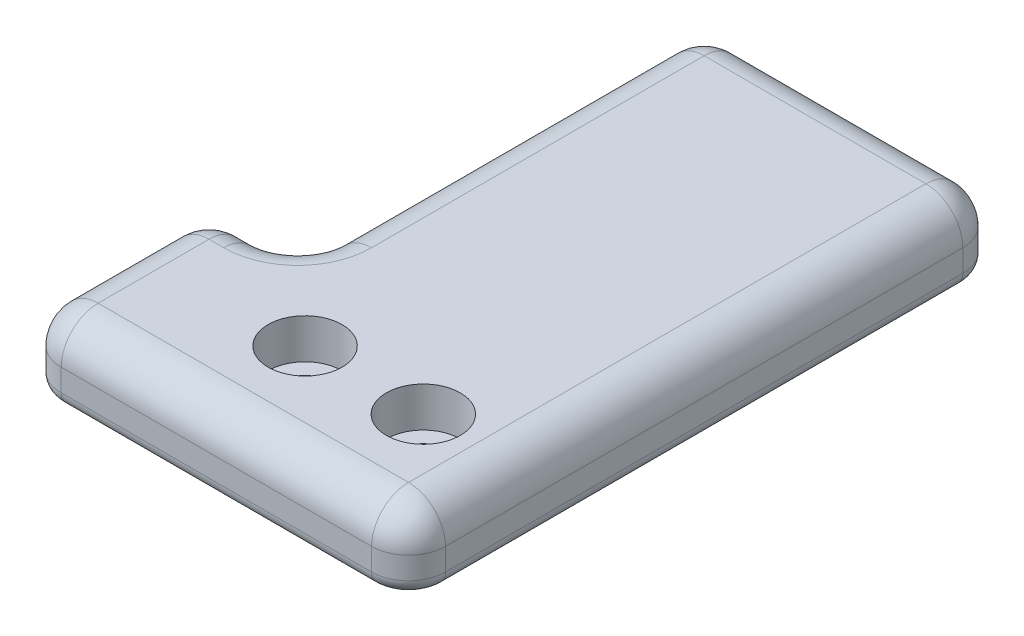
ISO-10303-21;
HEADER;
FILE_DESCRIPTION(('STEP AP214'),'2;1');
FILE_NAME('part.step','',(''),(''),'','','');
FILE_SCHEMA(('AUTOMOTIVE_DESIGN { 1 0 10303 214 1 1 1 1 }'));
ENDSEC;
DATA;
#1=APPLICATION_CONTEXT('core data for automotive mechanical design processes');
#2=APPLICATION_PROTOCOL_DEFINITION('international standard','automotive_design',2000,#1);
#3=PRODUCT_CONTEXT('',#1,'mechanical');
#4=PRODUCT('Part','Part','',(#3));
#5=PRODUCT_RELATED_PRODUCT_CATEGORY('part','',(#4));
#6=PRODUCT_DEFINITION_FORMATION('','',#4);
#7=PRODUCT_DEFINITION_CONTEXT('part definition',#1,'design');
#8=PRODUCT_DEFINITION('design','',#6,#7);
#9=PRODUCT_DEFINITION_SHAPE('','',#8);
#10=(LENGTH_UNIT() NAMED_UNIT(*) SI_UNIT(.MILLI.,.METRE.));
#11=(NAMED_UNIT(*) PLANE_ANGLE_UNIT() SI_UNIT($,.RADIAN.));
#12=(NAMED_UNIT(*) SI_UNIT($,.STERADIAN.) SOLID_ANGLE_UNIT());
#13=UNCERTAINTY_MEASURE_WITH_UNIT(LENGTH_MEASURE(1.E-05),#10,'distance_accuracy_value','');
#14=(GEOMETRIC_REPRESENTATION_CONTEXT(3) GLOBAL_UNCERTAINTY_ASSIGNED_CONTEXT((#13)) GLOBAL_UNIT_ASSIGNED_CONTEXT((#10,
#11,#12)) REPRESENTATION_CONTEXT('',''));
#15=CARTESIAN_POINT('',(0.,0.,0.));
#16=DIRECTION('',(0.,0.,1.));
#17=DIRECTION('',(1.,0.,0.));
#18=AXIS2_PLACEMENT_3D('',#15,#16,#17);
#19=CARTESIAN_POINT('',(15.7975674601214,10.,0.));
#20=DIRECTION('',(-1.,0.,0.));
#21=DIRECTION('',(0.,0.,-1.));
#22=AXIS2_PLACEMENT_3D('',#19,#20,#21);
#23=PLANE('',#22);
#24=DIRECTION('',(0.,-1.,0.));
#25=VECTOR('',#24,1.);
#26=CARTESIAN_POINT('',(15.7975674601214,10.,67.0000000000004));
#27=LINE('',#26,#25);
#28=CARTESIAN_POINT('',(15.7975674601214,5.,67.0000000000004));
#29=VERTEX_POINT('',#28);
#30=CARTESIAN_POINT('',(15.7975674601214,2.,67.0000000000004));
#31=VERTEX_POINT('',#30);
#32=EDGE_CURVE('E357',#29,#31,#27,.T.);
#33=ORIENTED_EDGE('',*,*,#32,.F.);
#34=DIRECTION('',(0.,0.,1.));
#35=VECTOR('',#34,1.);
#36=CARTESIAN_POINT('',(15.7975674601214,5.,0.));
#37=LINE('',#36,#35);
#38=CARTESIAN_POINT('',(15.7975674601214,5.,52.0000000000003));
#39=VERTEX_POINT('',#38);
#40=EDGE_CURVE('E356',#39,#29,#37,.T.);
#41=ORIENTED_EDGE('',*,*,#40,.F.);
#42=DIRECTION('',(0.,-1.,0.));
#43=VECTOR('',#42,1.);
#44=CARTESIAN_POINT('',(15.7975674601214,10.,52.0000000000003));
#45=LINE('',#44,#43);
#46=CARTESIAN_POINT('',(15.7975674601214,2.,52.0000000000003));
#47=VERTEX_POINT('',#46);
#48=EDGE_CURVE('E217',#47,#39,#45,.F.);
#49=ORIENTED_EDGE('',*,*,#48,.F.);
#50=DIRECTION('',(0.,0.,1.));
#51=VECTOR('',#50,1.);
#52=CARTESIAN_POINT('',(15.7975674601214,2.,52.0000000000003));
#53=LINE('',#52,#51);
#54=EDGE_CURVE('E301',#31,#47,#53,.F.);
#55=ORIENTED_EDGE('',*,*,#54,.F.);
#56=EDGE_LOOP('',(#33,#41,#49,#55));
#57=FACE_BOUND('',#56,.T.);
#58=ADVANCED_FACE('F39',(#57),#23,.T.);
#59=CARTESIAN_POINT('',(3.26128013483643E-13,10.,47.0000000000005));
#60=DIRECTION('',(0.,0.,-1.));
#61=DIRECTION('',(1.,0.,0.));
#62=AXIS2_PLACEMENT_3D('',#59,#60,#61);
#63=PLANE('',#62);
#64=DIRECTION('',(0.,-1.,0.));
#65=VECTOR('',#64,1.);
#66=CARTESIAN_POINT('',(20.7975674601214,10.,47.0000000000003));
#67=LINE('',#66,#65);
#68=CARTESIAN_POINT('',(20.7975674601214,5.,47.0000000000003));
#69=VERTEX_POINT('',#68);
#70=CARTESIAN_POINT('',(20.7975674601214,2.,47.0000000000003));
#71=VERTEX_POINT('',#70);
#72=EDGE_CURVE('E349',#69,#71,#67,.T.);
#73=ORIENTED_EDGE('',*,*,#72,.F.);
#74=DIRECTION('',(-1.,0.,0.));
#75=VECTOR('',#74,1.);
#76=CARTESIAN_POINT('',(3.26128013483643E-13,5.,47.0000000000005));
#77=LINE('',#76,#75);
#78=CARTESIAN_POINT('',(22.7975674601214,5.,47.0000000000003));
#79=VERTEX_POINT('',#78);
#80=EDGE_CURVE('E405',#79,#69,#77,.T.);
#81=ORIENTED_EDGE('',*,*,#80,.F.);
#82=DIRECTION('',(0.,-1.,0.));
#83=VECTOR('',#82,1.);
#84=CARTESIAN_POINT('',(22.7975674601214,10.,47.0000000000003));
#85=LINE('',#84,#83);
#86=CARTESIAN_POINT('',(22.7975674601214,2.,47.0000000000003));
#87=VERTEX_POINT('',#86);
#88=EDGE_CURVE('E209',#87,#79,#85,.F.);
#89=ORIENTED_EDGE('',*,*,#88,.F.);
#90=DIRECTION('',(-1.,0.,0.));
#91=VECTOR('',#90,1.);
#92=CARTESIAN_POINT('',(22.7975674601214,2.,47.0000000000003));
#93=LINE('',#92,#91);
#94=EDGE_CURVE('E307',#71,#87,#93,.F.);
#95=ORIENTED_EDGE('',*,*,#94,.F.);
#96=EDGE_LOOP('',(#73,#81,#89,#95));
#97=FACE_BOUND('',#96,.T.);
#98=ADVANCED_FACE('F496',(#97),#63,.T.);
#99=CARTESIAN_POINT('',(27.7975674601214,10.,0.));
#100=DIRECTION('',(-1.,0.,0.));
#101=DIRECTION('',(0.,0.,-1.));
#102=AXIS2_PLACEMENT_3D('',#99,#100,#101);
#103=PLANE('',#102);
#104=DIRECTION('',(0.,-1.,0.));
#105=VECTOR('',#104,1.);
#106=CARTESIAN_POINT('',(27.7975674601214,0.,42.0000000000003));
#107=LINE('',#106,#105);
#108=CARTESIAN_POINT('',(27.7975674601214,5.,42.0000000000003));
#109=VERTEX_POINT('',#108);
#110=CARTESIAN_POINT('',(27.7975674601214,2.,42.0000000000003));
#111=VERTEX_POINT('',#110);
#112=EDGE_CURVE('E218',#109,#111,#107,.T.);
#113=ORIENTED_EDGE('',*,*,#112,.F.);
#114=DIRECTION('',(0.,0.,1.));
#115=VECTOR('',#114,1.);
#116=CARTESIAN_POINT('',(27.7975674601214,5.,0.));
#117=LINE('',#116,#115);
#118=CARTESIAN_POINT('',(27.7975674601214,5.,-2.99999999999973));
#119=VERTEX_POINT('',#118);
#120=EDGE_CURVE('E192',#119,#109,#117,.T.);
#121=ORIENTED_EDGE('',*,*,#120,.F.);
#122=DIRECTION('',(0.,-1.,0.));
#123=VECTOR('',#122,1.);
#124=CARTESIAN_POINT('',(27.7975674601214,10.,-2.99999999999973));
#125=LINE('',#124,#123);
#126=CARTESIAN_POINT('',(27.7975674601214,2.,-2.99999999999973));
#127=VERTEX_POINT('',#126);
#128=EDGE_CURVE('E212',#127,#119,#125,.F.);
#129=ORIENTED_EDGE('',*,*,#128,.F.);
#130=DIRECTION('',(0.,0.,1.));
#131=VECTOR('',#130,1.);
#132=CARTESIAN_POINT('',(27.7975674601214,2.,-2.99999999999973));
#133=LINE('',#132,#131);
#134=EDGE_CURVE('E313',#111,#127,#133,.F.);
#135=ORIENTED_EDGE('',*,*,#134,.F.);
#136=EDGE_LOOP('',(#113,#121,#129,#135));
#137=FACE_BOUND('',#136,.T.);
#138=ADVANCED_FACE('F220',(#137),#103,.T.);
#139=CARTESIAN_POINT('',(0.,10.,-7.99999999999973));
#140=DIRECTION('',(0.,0.,1.));
#141=DIRECTION('',(-1.,0.,0.));
#142=AXIS2_PLACEMENT_3D('',#139,#140,#141);
#143=PLANE('',#142);
#144=DIRECTION('',(0.,-1.,0.));
#145=VECTOR('',#144,1.);
#146=CARTESIAN_POINT('',(32.7975674601214,0.,-7.99999999999973));
#147=LINE('',#146,#145);
#148=CARTESIAN_POINT('',(32.7975674601214,5.,-7.99999999999973));
#149=VERTEX_POINT('',#148);
#150=CARTESIAN_POINT('',(32.7975674601214,2.,-7.99999999999973));
#151=VERTEX_POINT('',#150);
#152=EDGE_CURVE('E428',#149,#151,#147,.T.);
#153=ORIENTED_EDGE('',*,*,#152,.F.);
#154=DIRECTION('',(1.,0.,0.));
#155=VECTOR('',#154,1.);
#156=CARTESIAN_POINT('',(32.7975674601214,5.,-7.99999999999973));
#157=LINE('',#156,#155);
#158=CARTESIAN_POINT('',(62.7975674601214,5.,-7.99999999999973));
#159=VERTEX_POINT('',#158);
#160=EDGE_CURVE('E223',#159,#149,#157,.F.);
#161=ORIENTED_EDGE('',*,*,#160,.F.);
#162=DIRECTION('',(0.,-1.,0.));
#163=VECTOR('',#162,1.);
#164=CARTESIAN_POINT('',(62.7975674601214,10.,-7.99999999999973));
#165=LINE('',#164,#163);
#166=CARTESIAN_POINT('',(62.7975674601214,2.,-7.99999999999973));
#167=VERTEX_POINT('',#166);
#168=EDGE_CURVE('E253',#167,#159,#165,.F.);
#169=ORIENTED_EDGE('',*,*,#168,.F.);
#170=DIRECTION('',(1.,0.,0.));
#171=VECTOR('',#170,1.);
#172=CARTESIAN_POINT('',(0.,2.,-7.99999999999973));
#173=LINE('',#172,#171);
#174=EDGE_CURVE('E11',#151,#167,#173,.T.);
#175=ORIENTED_EDGE('',*,*,#174,.F.);
#176=EDGE_LOOP('',(#153,#161,#169,#175));
#177=FACE_BOUND('',#176,.T.);
#178=ADVANCED_FACE('F431',(#177),#143,.F.);
#179=CARTESIAN_POINT('',(67.7975674601214,10.,0.));
#180=DIRECTION('',(-1.,0.,0.));
#181=DIRECTION('',(0.,0.,-1.));
#182=AXIS2_PLACEMENT_3D('',#179,#180,#181);
#183=PLANE('',#182);
#184=DIRECTION('',(0.,-1.,0.));
#185=VECTOR('',#184,1.);
#186=CARTESIAN_POINT('',(67.7975674601214,10.,-2.99999999999973));
#187=LINE('',#186,#185);
#188=CARTESIAN_POINT('',(67.7975674601214,5.,-2.99999999999973));
#189=VERTEX_POINT('',#188);
#190=CARTESIAN_POINT('',(67.7975674601214,2.,-2.99999999999973));
#191=VERTEX_POINT('',#190);
#192=EDGE_CURVE('E368',#189,#191,#187,.T.);
#193=ORIENTED_EDGE('',*,*,#192,.F.);
#194=DIRECTION('',(0.,0.,1.));
#195=VECTOR('',#194,1.);
#196=CARTESIAN_POINT('',(67.7975674601214,5.,-2.99999999999973));
#197=LINE('',#196,#195);
#198=CARTESIAN_POINT('',(67.7975674601214,5.,67.0000000000003));
#199=VERTEX_POINT('',#198);
#200=EDGE_CURVE('E414',#199,#189,#197,.F.);
#201=ORIENTED_EDGE('',*,*,#200,.F.);
#202=DIRECTION('',(0.,-1.,0.));
#203=VECTOR('',#202,1.);
#204=CARTESIAN_POINT('',(67.7975674601214,10.,67.0000000000003));
#205=LINE('',#204,#203);
#206=CARTESIAN_POINT('',(67.7975674601214,2.,67.0000000000003));
#207=VERTEX_POINT('',#206);
#208=EDGE_CURVE('E371',#207,#199,#205,.F.);
#209=ORIENTED_EDGE('',*,*,#208,.F.);
#210=DIRECTION('',(0.,0.,1.));
#211=VECTOR('',#210,1.);
#212=CARTESIAN_POINT('',(67.7975674601214,2.,0.));
#213=LINE('',#212,#211);
#214=EDGE_CURVE('E289',#191,#207,#213,.T.);
#215=ORIENTED_EDGE('',*,*,#214,.F.);
#216=EDGE_LOOP('',(#193,#201,#209,#215));
#217=FACE_BOUND('',#216,.T.);
#218=ADVANCED_FACE('F446',(#217),#183,.F.);
#219=CARTESIAN_POINT('',(1.15292391018767E-13,10.,72.0000000000004));
#220=DIRECTION('',(0.,0.,1.));
#221=DIRECTION('',(-1.,0.,0.));
#222=AXIS2_PLACEMENT_3D('',#219,#220,#221);
#223=PLANE('',#222);
#224=DIRECTION('',(0.,-1.,0.));
#225=VECTOR('',#224,1.);
#226=CARTESIAN_POINT('',(62.7975674601214,0.,72.0000000000003));
#227=LINE('',#226,#225);
#228=CARTESIAN_POINT('',(62.7975674601214,5.,72.0000000000003));
#229=VERTEX_POINT('',#228);
#230=CARTESIAN_POINT('',(62.7975674601214,2.,72.0000000000003));
#231=VERTEX_POINT('',#230);
#232=EDGE_CURVE('E359',#229,#231,#227,.T.);
#233=ORIENTED_EDGE('',*,*,#232,.F.);
#234=DIRECTION('',(1.,0.,0.));
#235=VECTOR('',#234,1.);
#236=CARTESIAN_POINT('',(1.15292391018767E-13,5.,72.0000000000004));
#237=LINE('',#236,#235);
#238=CARTESIAN_POINT('',(20.7975674601214,5.,72.0000000000004));
#239=VERTEX_POINT('',#238);
#240=EDGE_CURVE('E411',#239,#229,#237,.T.);
#241=ORIENTED_EDGE('',*,*,#240,.F.);
#242=DIRECTION('',(0.,-1.,0.));
#243=VECTOR('',#242,1.);
#244=CARTESIAN_POINT('',(20.7975674601214,10.,72.0000000000004));
#245=LINE('',#244,#243);
#246=CARTESIAN_POINT('',(20.7975674601214,2.,72.0000000000004));
#247=VERTEX_POINT('',#246);
#248=EDGE_CURVE('E365',#247,#239,#245,.F.);
#249=ORIENTED_EDGE('',*,*,#248,.F.);
#250=DIRECTION('',(1.,0.,0.));
#251=VECTOR('',#250,1.);
#252=CARTESIAN_POINT('',(20.7975674601214,2.,72.0000000000004));
#253=LINE('',#252,#251);
#254=EDGE_CURVE('E295',#231,#247,#253,.F.);
#255=ORIENTED_EDGE('',*,*,#254,.F.);
#256=EDGE_LOOP('',(#233,#241,#249,#255));
#257=FACE_BOUND('',#256,.T.);
#258=ADVANCED_FACE('F686',(#257),#223,.T.);
#259=CARTESIAN_POINT('',(0.,10.,0.));
#260=DIRECTION('',(0.,1.,0.));
#261=DIRECTION('',(0.,0.,-1.));
#262=AXIS2_PLACEMENT_3D('',#259,#260,#261);
#263=PLANE('',#262);
#264=CARTESIAN_POINT('',(55.7975674601214,10.,58.0000000000002));
#265=DIRECTION('',(0.,-1.,0.));
#266=DIRECTION('',(0.,0.,-1.));
#267=AXIS2_PLACEMENT_3D('',#264,#265,#266);
#268=CIRCLE('',#267,5.);
#269=CARTESIAN_POINT('',(55.7975674601214,10.,53.0000000000002));
#270=VERTEX_POINT('',#269);
#271=EDGE_CURVE('E478',#270,#270,#268,.T.);
#272=ORIENTED_EDGE('',*,*,#271,.T.);
#273=EDGE_LOOP('',(#272));
#274=FACE_BOUND('',#273,.T.);
#275=CARTESIAN_POINT('',(39.7975674601214,10.,58.0000000000003));
#276=DIRECTION('',(0.,-1.,0.));
#277=DIRECTION('',(0.,0.,-1.));
#278=AXIS2_PLACEMENT_3D('',#275,#276,#277);
#279=CIRCLE('',#278,5.);
#280=CARTESIAN_POINT('',(39.7975674601214,10.,53.0000000000003));
#281=VERTEX_POINT('',#280);
#282=EDGE_CURVE('E466',#281,#281,#279,.T.);
#283=ORIENTED_EDGE('',*,*,#282,.T.);
#284=EDGE_LOOP('',(#283));
#285=FACE_BOUND('',#284,.T.);
#286=DIRECTION('',(1.,0.,0.));
#287=VECTOR('',#286,1.);
#288=CARTESIAN_POINT('',(1.07285974975797E-13,10.,67.0000000000004));
#289=LINE('',#288,#287);
#290=CARTESIAN_POINT('',(62.7975674601214,10.,67.0000000000003));
#291=VERTEX_POINT('',#290);
#292=CARTESIAN_POINT('',(20.7975674601214,10.,67.0000000000004));
#293=VERTEX_POINT('',#292);
#294=EDGE_CURVE('E390',#291,#293,#289,.F.);
#295=ORIENTED_EDGE('',*,*,#294,.F.);
#296=DIRECTION('',(0.,0.,1.));
#297=VECTOR('',#296,1.);
#298=CARTESIAN_POINT('',(62.7975674601214,10.,67.0000000000003));
#299=LINE('',#298,#297);
#300=CARTESIAN_POINT('',(62.7975674601214,10.,-2.99999999999973));
#301=VERTEX_POINT('',#300);
#302=EDGE_CURVE('E387',#301,#291,#299,.T.);
#303=ORIENTED_EDGE('',*,*,#302,.F.);
#304=DIRECTION('',(1.,0.,0.));
#305=VECTOR('',#304,1.);
#306=CARTESIAN_POINT('',(62.7975674601214,10.,-2.99999999999973));
#307=LINE('',#306,#305);
#308=CARTESIAN_POINT('',(32.7975674601214,10.,-2.99999999999973));
#309=VERTEX_POINT('',#308);
#310=EDGE_CURVE('E384',#309,#301,#307,.T.);
#311=ORIENTED_EDGE('',*,*,#310,.F.);
#312=DIRECTION('',(0.,0.,1.));
#313=VECTOR('',#312,1.);
#314=CARTESIAN_POINT('',(32.7975674601214,10.,0.));
#315=LINE('',#314,#313);
#316=CARTESIAN_POINT('',(32.7975674601214,10.,42.0000000000003));
#317=VERTEX_POINT('',#316);
#318=EDGE_CURVE('E195',#317,#309,#315,.F.);
#319=ORIENTED_EDGE('',*,*,#318,.F.);
#320=CARTESIAN_POINT('',(22.7975674601214,10.,42.0000000000003));
#321=DIRECTION('',(0.,-1.,0.));
#322=DIRECTION('',(0.,0.,-1.));
#323=AXIS2_PLACEMENT_3D('',#320,#321,#322);
#324=CIRCLE('',#323,10.);
#325=CARTESIAN_POINT('',(22.7975674601215,10.,52.0000000000003));
#326=VERTEX_POINT('',#325);
#327=EDGE_CURVE('E393',#326,#317,#324,.F.);
#328=ORIENTED_EDGE('',*,*,#327,.F.);
#329=DIRECTION('',(-1.,0.,0.));
#330=VECTOR('',#329,1.);
#331=CARTESIAN_POINT('',(3.60822483003179E-13,10.,52.0000000000005));
#332=LINE('',#331,#330);
#333=CARTESIAN_POINT('',(20.7975674601214,10.,52.0000000000003));
#334=VERTEX_POINT('',#333);
#335=EDGE_CURVE('E396',#334,#326,#332,.F.);
#336=ORIENTED_EDGE('',*,*,#335,.F.);
#337=DIRECTION('',(0.,0.,1.));
#338=VECTOR('',#337,1.);
#339=CARTESIAN_POINT('',(20.7975674601214,10.,0.));
#340=LINE('',#339,#338);
#341=EDGE_CURVE('E399',#293,#334,#340,.F.);
#342=ORIENTED_EDGE('',*,*,#341,.F.);
#343=EDGE_LOOP('',(#295,#303,#311,#319,#328,#336,#342));
#344=FACE_BOUND('',#343,.T.);
#345=ADVANCED_FACE('F437',(#274,#285,#344),#263,.T.);
#346=CARTESIAN_POINT('',(0.,0.,0.));
#347=DIRECTION('',(0.,1.,0.));
#348=DIRECTION('',(0.,0.,-1.));
#349=AXIS2_PLACEMENT_3D('',#346,#347,#348);
#350=PLANE('',#349);
#351=CARTESIAN_POINT('',(55.7975674601214,0.,58.0000000000002));
#352=DIRECTION('',(0.,-1.,0.));
#353=DIRECTION('',(0.,0.,-1.));
#354=AXIS2_PLACEMENT_3D('',#351,#352,#353);
#355=CIRCLE('',#354,2.75);
#356=CARTESIAN_POINT('',(55.7975674601214,0.,55.2500000000002));
#357=VERTEX_POINT('',#356);
#358=EDGE_CURVE('E469',#357,#357,#355,.T.);
#359=ORIENTED_EDGE('',*,*,#358,.F.);
#360=EDGE_LOOP('',(#359));
#361=FACE_BOUND('',#360,.T.);
#362=CARTESIAN_POINT('',(39.7975674601214,0.,58.0000000000003));
#363=DIRECTION('',(0.,-1.,0.));
#364=DIRECTION('',(0.,0.,-1.));
#365=AXIS2_PLACEMENT_3D('',#362,#363,#364);
#366=CIRCLE('',#365,2.75);
#367=CARTESIAN_POINT('',(39.7975674601214,0.,55.2500000000003));
#368=VERTEX_POINT('',#367);
#369=EDGE_CURVE('E319',#368,#368,#366,.T.);
#370=ORIENTED_EDGE('',*,*,#369,.F.);
#371=EDGE_LOOP('',(#370));
#372=FACE_BOUND('',#371,.T.);
#373=DIRECTION('',(0.,0.,1.));
#374=VECTOR('',#373,1.);
#375=CARTESIAN_POINT('',(65.7975674601214,0.,0.));
#376=LINE('',#375,#374);
#377=CARTESIAN_POINT('',(65.7975674601214,0.,67.0000000000003));
#378=VERTEX_POINT('',#377);
#379=CARTESIAN_POINT('',(65.7975674601214,0.,-2.99999999999973));
#380=VERTEX_POINT('',#379);
#381=EDGE_CURVE('E280',#378,#380,#376,.F.);
#382=ORIENTED_EDGE('',*,*,#381,.F.);
#383=CARTESIAN_POINT('',(62.7975674601214,0.,67.0000000000003));
#384=DIRECTION('',(0.,-1.,0.));
#385=DIRECTION('',(0.,0.,-1.));
#386=AXIS2_PLACEMENT_3D('',#383,#384,#385);
#387=CIRCLE('',#386,3.);
#388=CARTESIAN_POINT('',(62.7975674601214,0.,70.0000000000003));
#389=VERTEX_POINT('',#388);
#390=EDGE_CURVE('E277',#389,#378,#387,.F.);
#391=ORIENTED_EDGE('',*,*,#390,.F.);
#392=DIRECTION('',(1.,0.,0.));
#393=VECTOR('',#392,1.);
#394=CARTESIAN_POINT('',(62.7975674601214,0.,70.0000000000003));
#395=LINE('',#394,#393);
#396=CARTESIAN_POINT('',(20.7975674601214,0.,70.0000000000004));
#397=VERTEX_POINT('',#396);
#398=EDGE_CURVE('E274',#397,#389,#395,.T.);
#399=ORIENTED_EDGE('',*,*,#398,.F.);
#400=CARTESIAN_POINT('',(20.7975674601214,0.,67.0000000000004));
#401=DIRECTION('',(0.,-1.,0.));
#402=DIRECTION('',(0.,0.,-1.));
#403=AXIS2_PLACEMENT_3D('',#400,#401,#402);
#404=CIRCLE('',#403,3.);
#405=CARTESIAN_POINT('',(17.7975674601214,0.,67.0000000000004));
#406=VERTEX_POINT('',#405);
#407=EDGE_CURVE('E271',#406,#397,#404,.F.);
#408=ORIENTED_EDGE('',*,*,#407,.F.);
#409=DIRECTION('',(0.,0.,1.));
#410=VECTOR('',#409,1.);
#411=CARTESIAN_POINT('',(17.7975674601214,0.,67.0000000000004));
#412=LINE('',#411,#410);
#413=CARTESIAN_POINT('',(17.7975674601214,0.,52.0000000000003));
#414=VERTEX_POINT('',#413);
#415=EDGE_CURVE('E268',#414,#406,#412,.T.);
#416=ORIENTED_EDGE('',*,*,#415,.F.);
#417=CARTESIAN_POINT('',(20.7975674601214,0.,52.0000000000003));
#418=DIRECTION('',(0.,-1.,0.));
#419=DIRECTION('',(0.,0.,-1.));
#420=AXIS2_PLACEMENT_3D('',#417,#418,#419);
#421=CIRCLE('',#420,3.);
#422=CARTESIAN_POINT('',(20.7975674601214,0.,49.0000000000003));
#423=VERTEX_POINT('',#422);
#424=EDGE_CURVE('E265',#423,#414,#421,.F.);
#425=ORIENTED_EDGE('',*,*,#424,.F.);
#426=DIRECTION('',(-1.,0.,0.));
#427=VECTOR('',#426,1.);
#428=CARTESIAN_POINT('',(20.7975674601214,0.,49.0000000000003));
#429=LINE('',#428,#427);
#430=CARTESIAN_POINT('',(22.7975674601214,0.,49.0000000000003));
#431=VERTEX_POINT('',#430);
#432=EDGE_CURVE('E262',#431,#423,#429,.T.);
#433=ORIENTED_EDGE('',*,*,#432,.F.);
#434=CARTESIAN_POINT('',(22.7975674601214,0.,42.0000000000003));
#435=DIRECTION('',(0.,-1.,0.));
#436=DIRECTION('',(0.,0.,-1.));
#437=AXIS2_PLACEMENT_3D('',#434,#435,#436);
#438=CIRCLE('',#437,7.);
#439=CARTESIAN_POINT('',(29.7975674601214,0.,42.0000000000003));
#440=VERTEX_POINT('',#439);
#441=EDGE_CURVE('E259',#440,#431,#438,.T.);
#442=ORIENTED_EDGE('',*,*,#441,.F.);
#443=DIRECTION('',(0.,0.,1.));
#444=VECTOR('',#443,1.);
#445=CARTESIAN_POINT('',(29.7975674601214,0.,42.0000000000003));
#446=LINE('',#445,#444);
#447=CARTESIAN_POINT('',(29.7975674601214,0.,-2.99999999999973));
#448=VERTEX_POINT('',#447);
#449=EDGE_CURVE('E256',#448,#440,#446,.T.);
#450=ORIENTED_EDGE('',*,*,#449,.F.);
#451=CARTESIAN_POINT('',(32.7975674601214,0.,-2.99999999999973));
#452=DIRECTION('',(0.,-1.,0.));
#453=DIRECTION('',(0.,0.,-1.));
#454=AXIS2_PLACEMENT_3D('',#451,#452,#453);
#455=CIRCLE('',#454,3.);
#456=CARTESIAN_POINT('',(32.7975674601214,0.,-5.99999999999973));
#457=VERTEX_POINT('',#456);
#458=EDGE_CURVE('E225',#457,#448,#455,.F.);
#459=ORIENTED_EDGE('',*,*,#458,.F.);
#460=DIRECTION('',(1.,0.,0.));
#461=VECTOR('',#460,1.);
#462=CARTESIAN_POINT('',(0.,0.,-5.99999999999973));
#463=LINE('',#462,#461);
#464=CARTESIAN_POINT('',(62.7975674601214,0.,-5.99999999999973));
#465=VERTEX_POINT('',#464);
#466=EDGE_CURVE('E222',#465,#457,#463,.F.);
#467=ORIENTED_EDGE('',*,*,#466,.F.);
#468=CARTESIAN_POINT('',(62.7975674601214,0.,-2.99999999999973));
#469=DIRECTION('',(0.,-1.,0.));
#470=DIRECTION('',(0.,0.,-1.));
#471=AXIS2_PLACEMENT_3D('',#468,#469,#470);
#472=CIRCLE('',#471,3.);
#473=EDGE_CURVE('E283',#380,#465,#472,.F.);
#474=ORIENTED_EDGE('',*,*,#473,.F.);
#475=EDGE_LOOP('',(#382,#391,#399,#408,#416,#425,#433,#442,#450,#459,#467,#474));
#476=FACE_BOUND('',#475,.T.);
#477=ADVANCED_FACE('F508',(#361,#372,#476),#350,.F.);
#478=CARTESIAN_POINT('',(32.7975674601214,10.,-2.99999999999973));
#479=DIRECTION('',(0.,1.,0.));
#480=DIRECTION('',(0.,0.,-1.));
#481=AXIS2_PLACEMENT_3D('',#478,#479,#480);
#482=CYLINDRICAL_SURFACE('',#481,5.);
#483=ORIENTED_EDGE('',*,*,#128,.T.);
#484=CARTESIAN_POINT('',(32.7975674601214,5.,-2.99999999999973));
#485=DIRECTION('',(0.,-1.,0.));
#486=DIRECTION('',(0.,0.,-1.));
#487=AXIS2_PLACEMENT_3D('',#484,#485,#486);
#488=CIRCLE('',#487,5.);
#489=EDGE_CURVE('E202',#149,#119,#488,.F.);
#490=ORIENTED_EDGE('',*,*,#489,.F.);
#491=ORIENTED_EDGE('',*,*,#152,.T.);
#492=CARTESIAN_POINT('',(32.7975674601214,2.,-2.99999999999973));
#493=DIRECTION('',(0.,-1.,0.));
#494=DIRECTION('',(0.,0.,-1.));
#495=AXIS2_PLACEMENT_3D('',#492,#493,#494);
#496=CIRCLE('',#495,5.);
#497=EDGE_CURVE('E48',#127,#151,#496,.T.);
#498=ORIENTED_EDGE('',*,*,#497,.F.);
#499=EDGE_LOOP('',(#483,#490,#491,#498));
#500=FACE_BOUND('',#499,.T.);
#501=ADVANCED_FACE('F213',(#500),#482,.T.);
#502=CARTESIAN_POINT('',(20.7975674601214,10.,67.0000000000004));
#503=DIRECTION('',(0.,-1.,0.));
#504=DIRECTION('',(0.,0.,1.));
#505=AXIS2_PLACEMENT_3D('',#502,#503,#504);
#506=CYLINDRICAL_SURFACE('',#505,5.);
#507=ORIENTED_EDGE('',*,*,#248,.T.);
#508=CARTESIAN_POINT('',(20.7975674601214,5.,67.0000000000004));
#509=DIRECTION('',(0.,1.,0.));
#510=DIRECTION('',(0.,0.,1.));
#511=AXIS2_PLACEMENT_3D('',#508,#509,#510);
#512=CIRCLE('',#511,5.);
#513=EDGE_CURVE('E379',#29,#239,#512,.T.);
#514=ORIENTED_EDGE('',*,*,#513,.F.);
#515=ORIENTED_EDGE('',*,*,#32,.T.);
#516=CARTESIAN_POINT('',(20.7975674601214,2.,67.0000000000004));
#517=DIRECTION('',(0.,-1.,0.));
#518=DIRECTION('',(0.,0.,-1.));
#519=AXIS2_PLACEMENT_3D('',#516,#517,#518);
#520=CIRCLE('',#519,5.);
#521=EDGE_CURVE('E298',#247,#31,#520,.T.);
#522=ORIENTED_EDGE('',*,*,#521,.F.);
#523=EDGE_LOOP('',(#507,#514,#515,#522));
#524=FACE_BOUND('',#523,.T.);
#525=ADVANCED_FACE('F507',(#524),#506,.T.);
#526=CARTESIAN_POINT('',(62.7975674601214,10.,67.0000000000003));
#527=DIRECTION('',(0.,1.,0.));
#528=DIRECTION('',(0.,0.,-1.));
#529=AXIS2_PLACEMENT_3D('',#526,#527,#528);
#530=CYLINDRICAL_SURFACE('',#529,5.);
#531=ORIENTED_EDGE('',*,*,#208,.T.);
#532=CARTESIAN_POINT('',(62.7975674601214,5.,67.0000000000003));
#533=DIRECTION('',(0.,-1.,0.));
#534=DIRECTION('',(0.,0.,-1.));
#535=AXIS2_PLACEMENT_3D('',#532,#533,#534);
#536=CIRCLE('',#535,5.);
#537=EDGE_CURVE('E208',#229,#199,#536,.F.);
#538=ORIENTED_EDGE('',*,*,#537,.F.);
#539=ORIENTED_EDGE('',*,*,#232,.T.);
#540=CARTESIAN_POINT('',(62.7975674601214,2.,67.0000000000003));
#541=DIRECTION('',(0.,-1.,0.));
#542=DIRECTION('',(0.,0.,-1.));
#543=AXIS2_PLACEMENT_3D('',#540,#541,#542);
#544=CIRCLE('',#543,5.);
#545=EDGE_CURVE('E292',#207,#231,#544,.T.);
#546=ORIENTED_EDGE('',*,*,#545,.F.);
#547=EDGE_LOOP('',(#531,#538,#539,#546));
#548=FACE_BOUND('',#547,.T.);
#549=ADVANCED_FACE('F511',(#548),#530,.T.);
#550=CARTESIAN_POINT('',(22.7975674601214,10.,42.0000000000003));
#551=DIRECTION('',(0.,1.,0.));
#552=DIRECTION('',(0.,0.,-1.));
#553=AXIS2_PLACEMENT_3D('',#550,#551,#552);
#554=CYLINDRICAL_SURFACE('',#553,5.);
#555=ORIENTED_EDGE('',*,*,#88,.T.);
#556=CARTESIAN_POINT('',(22.7975674601214,5.,42.0000000000003));
#557=DIRECTION('',(0.,-1.,0.));
#558=DIRECTION('',(0.,0.,-1.));
#559=AXIS2_PLACEMENT_3D('',#556,#557,#558);
#560=CIRCLE('',#559,5.);
#561=EDGE_CURVE('E408',#109,#79,#560,.T.);
#562=ORIENTED_EDGE('',*,*,#561,.F.);
#563=ORIENTED_EDGE('',*,*,#112,.T.);
#564=CARTESIAN_POINT('',(22.7975674601214,2.,42.0000000000003));
#565=DIRECTION('',(0.,-1.,0.));
#566=DIRECTION('',(0.,0.,-1.));
#567=AXIS2_PLACEMENT_3D('',#564,#565,#566);
#568=CIRCLE('',#567,5.);
#569=EDGE_CURVE('E310',#87,#111,#568,.F.);
#570=ORIENTED_EDGE('',*,*,#569,.F.);
#571=EDGE_LOOP('',(#555,#562,#563,#570));
#572=FACE_BOUND('',#571,.T.);
#573=ADVANCED_FACE('F515',(#572),#554,.F.);
#574=CARTESIAN_POINT('',(62.7975674601214,10.,-2.99999999999973));
#575=DIRECTION('',(0.,-1.,0.));
#576=DIRECTION('',(0.,0.,1.));
#577=AXIS2_PLACEMENT_3D('',#574,#575,#576);
#578=CYLINDRICAL_SURFACE('',#577,5.);
#579=ORIENTED_EDGE('',*,*,#168,.T.);
#580=CARTESIAN_POINT('',(62.7975674601214,5.,-2.99999999999973));
#581=DIRECTION('',(0.,1.,0.));
#582=DIRECTION('',(0.,0.,1.));
#583=AXIS2_PLACEMENT_3D('',#580,#581,#582);
#584=CIRCLE('',#583,5.);
#585=EDGE_CURVE('E227',#189,#159,#584,.T.);
#586=ORIENTED_EDGE('',*,*,#585,.F.);
#587=ORIENTED_EDGE('',*,*,#192,.T.);
#588=CARTESIAN_POINT('',(62.7975674601214,2.,-2.99999999999973));
#589=DIRECTION('',(0.,-1.,0.));
#590=DIRECTION('',(0.,0.,-1.));
#591=AXIS2_PLACEMENT_3D('',#588,#589,#590);
#592=CIRCLE('',#591,5.);
#593=EDGE_CURVE('E286',#167,#191,#592,.T.);
#594=ORIENTED_EDGE('',*,*,#593,.F.);
#595=EDGE_LOOP('',(#579,#586,#587,#594));
#596=FACE_BOUND('',#595,.T.);
#597=ADVANCED_FACE('F425',(#596),#578,.T.);
#598=CARTESIAN_POINT('',(20.7975674601214,10.,52.0000000000003));
#599=DIRECTION('',(0.,-1.,0.));
#600=DIRECTION('',(0.,0.,1.));
#601=AXIS2_PLACEMENT_3D('',#598,#599,#600);
#602=CYLINDRICAL_SURFACE('',#601,5.);
#603=ORIENTED_EDGE('',*,*,#48,.T.);
#604=CARTESIAN_POINT('',(20.7975674601214,5.,52.0000000000003));
#605=DIRECTION('',(0.,1.,0.));
#606=DIRECTION('',(0.,0.,1.));
#607=AXIS2_PLACEMENT_3D('',#604,#605,#606);
#608=CIRCLE('',#607,5.);
#609=EDGE_CURVE('E402',#69,#39,#608,.T.);
#610=ORIENTED_EDGE('',*,*,#609,.F.);
#611=ORIENTED_EDGE('',*,*,#72,.T.);
#612=CARTESIAN_POINT('',(20.7975674601214,2.,52.0000000000003));
#613=DIRECTION('',(0.,-1.,0.));
#614=DIRECTION('',(0.,0.,-1.));
#615=AXIS2_PLACEMENT_3D('',#612,#613,#614);
#616=CIRCLE('',#615,5.);
#617=EDGE_CURVE('E304',#47,#71,#616,.T.);
#618=ORIENTED_EDGE('',*,*,#617,.F.);
#619=EDGE_LOOP('',(#603,#610,#611,#618));
#620=FACE_BOUND('',#619,.T.);
#621=ADVANCED_FACE('F344',(#620),#602,.T.);
#622=CARTESIAN_POINT('',(20.7975674601214,5.,67.0000000000004));
#623=DIRECTION('',(0.,0.,-1.));
#624=DIRECTION('',(1.,0.,0.));
#625=AXIS2_PLACEMENT_3D('',#622,#623,#624);
#626=SPHERICAL_SURFACE('',#625,5.);
#627=CARTESIAN_POINT('',(20.7975674601214,5.,67.0000000000004));
#628=DIRECTION('',(-1.,0.,0.));
#629=DIRECTION('',(0.,0.,1.));
#630=AXIS2_PLACEMENT_3D('',#627,#628,#629);
#631=CIRCLE('',#630,5.);
#632=EDGE_CURVE('E249',#239,#293,#631,.T.);
#633=ORIENTED_EDGE('',*,*,#632,.T.);
#634=CARTESIAN_POINT('',(20.7975674601214,5.,67.0000000000004));
#635=DIRECTION('',(0.,0.,1.));
#636=DIRECTION('',(1.,0.,0.));
#637=AXIS2_PLACEMENT_3D('',#634,#635,#636);
#638=CIRCLE('',#637,5.);
#639=EDGE_CURVE('E252',#293,#29,#638,.T.);
#640=ORIENTED_EDGE('',*,*,#639,.T.);
#641=ORIENTED_EDGE('',*,*,#513,.T.);
#642=EDGE_LOOP('',(#633,#640,#641));
#643=FACE_BOUND('',#642,.T.);
#644=ADVANCED_FACE('F524',(#643),#626,.T.);
#645=CARTESIAN_POINT('',(20.7975674601214,5.,0.));
#646=DIRECTION('',(0.,0.,1.));
#647=DIRECTION('',(-1.,0.,0.));
#648=AXIS2_PLACEMENT_3D('',#645,#646,#647);
#649=CYLINDRICAL_SURFACE('',#648,5.);
#650=ORIENTED_EDGE('',*,*,#639,.F.);
#651=ORIENTED_EDGE('',*,*,#341,.T.);
#652=CARTESIAN_POINT('',(20.7975674601214,5.,52.0000000000003));
#653=DIRECTION('',(0.,0.,1.));
#654=DIRECTION('',(1.,0.,0.));
#655=AXIS2_PLACEMENT_3D('',#652,#653,#654);
#656=CIRCLE('',#655,5.);
#657=EDGE_CURVE('E247',#334,#39,#656,.T.);
#658=ORIENTED_EDGE('',*,*,#657,.T.);
#659=ORIENTED_EDGE('',*,*,#40,.T.);
#660=EDGE_LOOP('',(#650,#651,#658,#659));
#661=FACE_BOUND('',#660,.T.);
#662=ADVANCED_FACE('F554',(#661),#649,.T.);
#663=CARTESIAN_POINT('',(1.07285974975797E-13,5.,67.0000000000004));
#664=DIRECTION('',(1.,0.,0.));
#665=DIRECTION('',(0.,0.,1.));
#666=AXIS2_PLACEMENT_3D('',#663,#664,#665);
#667=CYLINDRICAL_SURFACE('',#666,5.);
#668=ORIENTED_EDGE('',*,*,#632,.F.);
#669=ORIENTED_EDGE('',*,*,#240,.T.);
#670=CARTESIAN_POINT('',(62.7975674601214,5.,67.0000000000003));
#671=DIRECTION('',(-1.,0.,0.));
#672=DIRECTION('',(0.,0.,1.));
#673=AXIS2_PLACEMENT_3D('',#670,#671,#672);
#674=CIRCLE('',#673,5.);
#675=EDGE_CURVE('E244',#229,#291,#674,.T.);
#676=ORIENTED_EDGE('',*,*,#675,.T.);
#677=ORIENTED_EDGE('',*,*,#294,.T.);
#678=EDGE_LOOP('',(#668,#669,#676,#677));
#679=FACE_BOUND('',#678,.T.);
#680=ADVANCED_FACE('F550',(#679),#667,.T.);
#681=CARTESIAN_POINT('',(20.7975674601214,5.,52.0000000000003));
#682=DIRECTION('',(0.,0.,-1.));
#683=DIRECTION('',(1.,0.,0.));
#684=AXIS2_PLACEMENT_3D('',#681,#682,#683);
#685=SPHERICAL_SURFACE('',#684,5.);
#686=ORIENTED_EDGE('',*,*,#657,.F.);
#687=CARTESIAN_POINT('',(20.7975674601214,5.,52.0000000000003));
#688=DIRECTION('',(-1.,0.,0.));
#689=DIRECTION('',(0.,0.,1.));
#690=AXIS2_PLACEMENT_3D('',#687,#688,#689);
#691=CIRCLE('',#690,5.);
#692=EDGE_CURVE('E242',#334,#69,#691,.T.);
#693=ORIENTED_EDGE('',*,*,#692,.T.);
#694=ORIENTED_EDGE('',*,*,#609,.T.);
#695=EDGE_LOOP('',(#686,#693,#694));
#696=FACE_BOUND('',#695,.T.);
#697=ADVANCED_FACE('F546',(#696),#685,.T.);
#698=CARTESIAN_POINT('',(62.7975674601214,5.,67.0000000000003));
#699=DIRECTION('',(0.,0.,-1.));
#700=DIRECTION('',(1.,0.,0.));
#701=AXIS2_PLACEMENT_3D('',#698,#699,#700);
#702=SPHERICAL_SURFACE('',#701,5.);
#703=ORIENTED_EDGE('',*,*,#537,.T.);
#704=CARTESIAN_POINT('',(62.7975674601214,5.,67.0000000000003));
#705=DIRECTION('',(0.,0.,1.));
#706=DIRECTION('',(1.,0.,0.));
#707=AXIS2_PLACEMENT_3D('',#704,#705,#706);
#708=CIRCLE('',#707,5.);
#709=EDGE_CURVE('E240',#199,#291,#708,.T.);
#710=ORIENTED_EDGE('',*,*,#709,.T.);
#711=ORIENTED_EDGE('',*,*,#675,.F.);
#712=EDGE_LOOP('',(#703,#710,#711));
#713=FACE_BOUND('',#712,.T.);
#714=ADVANCED_FACE('F542',(#713),#702,.T.);
#715=CARTESIAN_POINT('',(3.60822483003179E-13,5.,52.0000000000005));
#716=DIRECTION('',(-1.,0.,0.));
#717=DIRECTION('',(0.,0.,-1.));
#718=AXIS2_PLACEMENT_3D('',#715,#716,#717);
#719=CYLINDRICAL_SURFACE('',#718,5.);
#720=ORIENTED_EDGE('',*,*,#692,.F.);
#721=ORIENTED_EDGE('',*,*,#335,.T.);
#722=CARTESIAN_POINT('',(22.7975674601215,5.,52.0000000000003));
#723=DIRECTION('',(-1.,0.,0.));
#724=DIRECTION('',(0.,0.,1.));
#725=AXIS2_PLACEMENT_3D('',#722,#723,#724);
#726=CIRCLE('',#725,5.);
#727=EDGE_CURVE('E238',#326,#79,#726,.T.);
#728=ORIENTED_EDGE('',*,*,#727,.T.);
#729=ORIENTED_EDGE('',*,*,#80,.T.);
#730=EDGE_LOOP('',(#720,#721,#728,#729));
#731=FACE_BOUND('',#730,.T.);
#732=ADVANCED_FACE('F539',(#731),#719,.T.);
#733=CARTESIAN_POINT('',(62.7975674601214,5.,0.));
#734=DIRECTION('',(0.,0.,-1.));
#735=DIRECTION('',(1.,0.,0.));
#736=AXIS2_PLACEMENT_3D('',#733,#734,#735);
#737=CYLINDRICAL_SURFACE('',#736,5.);
#738=ORIENTED_EDGE('',*,*,#709,.F.);
#739=ORIENTED_EDGE('',*,*,#200,.T.);
#740=CARTESIAN_POINT('',(62.7975674601214,5.,-2.99999999999973));
#741=DIRECTION('',(0.,0.,1.));
#742=DIRECTION('',(1.,0.,0.));
#743=AXIS2_PLACEMENT_3D('',#740,#741,#742);
#744=CIRCLE('',#743,5.);
#745=EDGE_CURVE('E235',#189,#301,#744,.T.);
#746=ORIENTED_EDGE('',*,*,#745,.T.);
#747=ORIENTED_EDGE('',*,*,#302,.T.);
#748=EDGE_LOOP('',(#738,#739,#746,#747));
#749=FACE_BOUND('',#748,.T.);
#750=ADVANCED_FACE('F440',(#749),#737,.T.);
#751=CARTESIAN_POINT('',(22.7975674601214,5.,42.0000000000003));
#752=DIRECTION('',(0.,1.,0.));
#753=DIRECTION('',(0.,0.,-1.));
#754=AXIS2_PLACEMENT_3D('',#751,#752,#753);
#755=TOROIDAL_SURFACE('',#754,10.,5.);
#756=ORIENTED_EDGE('',*,*,#727,.F.);
#757=ORIENTED_EDGE('',*,*,#327,.T.);
#758=CARTESIAN_POINT('',(32.7975674601214,5.,42.0000000000003));
#759=DIRECTION('',(0.,0.,1.));
#760=DIRECTION('',(1.,0.,0.));
#761=AXIS2_PLACEMENT_3D('',#758,#759,#760);
#762=CIRCLE('',#761,5.);
#763=EDGE_CURVE('E233',#317,#109,#762,.T.);
#764=ORIENTED_EDGE('',*,*,#763,.T.);
#765=ORIENTED_EDGE('',*,*,#561,.T.);
#766=EDGE_LOOP('',(#756,#757,#764,#765));
#767=FACE_BOUND('',#766,.T.);
#768=ADVANCED_FACE('F533',(#767),#755,.T.);
#769=CARTESIAN_POINT('',(62.7975674601214,5.,-2.99999999999973));
#770=DIRECTION('',(0.,0.,-1.));
#771=DIRECTION('',(1.,0.,0.));
#772=AXIS2_PLACEMENT_3D('',#769,#770,#771);
#773=SPHERICAL_SURFACE('',#772,5.);
#774=ORIENTED_EDGE('',*,*,#585,.T.);
#775=CARTESIAN_POINT('',(62.7975674601214,5.,-2.99999999999973));
#776=DIRECTION('',(1.,0.,0.));
#777=DIRECTION('',(0.,0.,-1.));
#778=AXIS2_PLACEMENT_3D('',#775,#776,#777);
#779=CIRCLE('',#778,5.);
#780=EDGE_CURVE('E198',#159,#301,#779,.T.);
#781=ORIENTED_EDGE('',*,*,#780,.T.);
#782=ORIENTED_EDGE('',*,*,#745,.F.);
#783=EDGE_LOOP('',(#774,#781,#782));
#784=FACE_BOUND('',#783,.T.);
#785=ADVANCED_FACE('F420',(#784),#773,.T.);
#786=CARTESIAN_POINT('',(32.7975674601214,5.,0.));
#787=DIRECTION('',(0.,0.,1.));
#788=DIRECTION('',(-1.,0.,0.));
#789=AXIS2_PLACEMENT_3D('',#786,#787,#788);
#790=CYLINDRICAL_SURFACE('',#789,5.);
#791=ORIENTED_EDGE('',*,*,#763,.F.);
#792=ORIENTED_EDGE('',*,*,#318,.T.);
#793=CARTESIAN_POINT('',(32.7975674601214,5.,-2.99999999999973));
#794=DIRECTION('',(0.,0.,1.));
#795=DIRECTION('',(1.,0.,0.));
#796=AXIS2_PLACEMENT_3D('',#793,#794,#795);
#797=CIRCLE('',#796,5.);
#798=EDGE_CURVE('E188',#309,#119,#797,.T.);
#799=ORIENTED_EDGE('',*,*,#798,.T.);
#800=ORIENTED_EDGE('',*,*,#120,.T.);
#801=EDGE_LOOP('',(#791,#792,#799,#800));
#802=FACE_BOUND('',#801,.T.);
#803=ADVANCED_FACE('F190',(#802),#790,.T.);
#804=CARTESIAN_POINT('',(0.,5.,-2.99999999999973));
#805=DIRECTION('',(-1.,0.,0.));
#806=DIRECTION('',(0.,0.,-1.));
#807=AXIS2_PLACEMENT_3D('',#804,#805,#806);
#808=CYLINDRICAL_SURFACE('',#807,5.);
#809=ORIENTED_EDGE('',*,*,#780,.F.);
#810=ORIENTED_EDGE('',*,*,#160,.T.);
#811=CARTESIAN_POINT('',(32.7975674601214,5.,-2.99999999999973));
#812=DIRECTION('',(1.,0.,0.));
#813=DIRECTION('',(0.,0.,-1.));
#814=AXIS2_PLACEMENT_3D('',#811,#812,#813);
#815=CIRCLE('',#814,5.);
#816=EDGE_CURVE('E199',#149,#309,#815,.T.);
#817=ORIENTED_EDGE('',*,*,#816,.T.);
#818=ORIENTED_EDGE('',*,*,#310,.T.);
#819=EDGE_LOOP('',(#809,#810,#817,#818));
#820=FACE_BOUND('',#819,.T.);
#821=ADVANCED_FACE('F433',(#820),#808,.T.);
#822=CARTESIAN_POINT('',(32.7975674601214,5.,-2.99999999999973));
#823=DIRECTION('',(0.,0.,-1.));
#824=DIRECTION('',(1.,0.,0.));
#825=AXIS2_PLACEMENT_3D('',#822,#823,#824);
#826=SPHERICAL_SURFACE('',#825,5.);
#827=ORIENTED_EDGE('',*,*,#798,.F.);
#828=ORIENTED_EDGE('',*,*,#816,.F.);
#829=ORIENTED_EDGE('',*,*,#489,.T.);
#830=EDGE_LOOP('',(#827,#828,#829));
#831=FACE_BOUND('',#830,.T.);
#832=ADVANCED_FACE('F204',(#831),#826,.T.);
#833=CARTESIAN_POINT('',(20.7975674601214,2.,52.0000000000003));
#834=DIRECTION('',(0.,1.,0.));
#835=DIRECTION('',(0.,0.,-1.));
#836=AXIS2_PLACEMENT_3D('',#833,#834,#835);
#837=TOROIDAL_SURFACE('',#836,3.,2.);
#838=CARTESIAN_POINT('',(20.7975674601214,2.,49.0000000000003));
#839=DIRECTION('',(-1.,0.,0.));
#840=DIRECTION('',(0.,0.,1.));
#841=AXIS2_PLACEMENT_3D('',#838,#839,#840);
#842=CIRCLE('',#841,2.);
#843=EDGE_CURVE('E334',#71,#423,#842,.T.);
#844=ORIENTED_EDGE('',*,*,#843,.T.);
#845=ORIENTED_EDGE('',*,*,#424,.T.);
#846=CARTESIAN_POINT('',(17.7975674601214,2.,52.0000000000003));
#847=DIRECTION('',(0.,0.,-1.));
#848=DIRECTION('',(-1.,0.,0.));
#849=AXIS2_PLACEMENT_3D('',#846,#847,#848);
#850=CIRCLE('',#849,2.);
#851=EDGE_CURVE('E43',#414,#47,#850,.T.);
#852=ORIENTED_EDGE('',*,*,#851,.T.);
#853=ORIENTED_EDGE('',*,*,#617,.T.);
#854=EDGE_LOOP('',(#844,#845,#852,#853));
#855=FACE_BOUND('',#854,.T.);
#856=ADVANCED_FACE('F41',(#855),#837,.T.);
#857=CARTESIAN_POINT('',(17.7975674601214,2.,0.));
#858=DIRECTION('',(0.,0.,-1.));
#859=DIRECTION('',(1.,0.,0.));
#860=AXIS2_PLACEMENT_3D('',#857,#858,#859);
#861=CYLINDRICAL_SURFACE('',#860,2.);
#862=ORIENTED_EDGE('',*,*,#851,.F.);
#863=ORIENTED_EDGE('',*,*,#415,.T.);
#864=CARTESIAN_POINT('',(17.7975674601214,2.,67.0000000000004));
#865=DIRECTION('',(0.,0.,-1.));
#866=DIRECTION('',(-1.,0.,0.));
#867=AXIS2_PLACEMENT_3D('',#864,#865,#866);
#868=CIRCLE('',#867,2.);
#869=EDGE_CURVE('E333',#406,#31,#868,.T.);
#870=ORIENTED_EDGE('',*,*,#869,.T.);
#871=ORIENTED_EDGE('',*,*,#54,.T.);
#872=EDGE_LOOP('',(#862,#863,#870,#871));
#873=FACE_BOUND('',#872,.T.);
#874=ADVANCED_FACE('F351',(#873),#861,.T.);
#875=CARTESIAN_POINT('',(3.40005801291457E-13,2.,49.0000000000005));
#876=DIRECTION('',(1.,0.,0.));
#877=DIRECTION('',(0.,0.,1.));
#878=AXIS2_PLACEMENT_3D('',#875,#876,#877);
#879=CYLINDRICAL_SURFACE('',#878,2.);
#880=ORIENTED_EDGE('',*,*,#843,.F.);
#881=ORIENTED_EDGE('',*,*,#94,.T.);
#882=CARTESIAN_POINT('',(22.7975674601214,2.,49.0000000000003));
#883=DIRECTION('',(-1.,0.,0.));
#884=DIRECTION('',(0.,0.,1.));
#885=AXIS2_PLACEMENT_3D('',#882,#883,#884);
#886=CIRCLE('',#885,2.);
#887=EDGE_CURVE('E331',#87,#431,#886,.T.);
#888=ORIENTED_EDGE('',*,*,#887,.T.);
#889=ORIENTED_EDGE('',*,*,#432,.T.);
#890=EDGE_LOOP('',(#880,#881,#888,#889));
#891=FACE_BOUND('',#890,.T.);
#892=ADVANCED_FACE('F591',(#891),#879,.T.);
#893=CARTESIAN_POINT('',(20.7975674601214,2.,67.0000000000004));
#894=DIRECTION('',(0.,1.,0.));
#895=DIRECTION('',(0.,0.,-1.));
#896=AXIS2_PLACEMENT_3D('',#893,#894,#895);
#897=TOROIDAL_SURFACE('',#896,3.,2.);
#898=ORIENTED_EDGE('',*,*,#869,.F.);
#899=ORIENTED_EDGE('',*,*,#407,.T.);
#900=CARTESIAN_POINT('',(20.7975674601214,2.,70.0000000000004));
#901=DIRECTION('',(-1.,0.,0.));
#902=DIRECTION('',(0.,0.,1.));
#903=AXIS2_PLACEMENT_3D('',#900,#901,#902);
#904=CIRCLE('',#903,2.);
#905=EDGE_CURVE('E329',#397,#247,#904,.T.);
#906=ORIENTED_EDGE('',*,*,#905,.T.);
#907=ORIENTED_EDGE('',*,*,#521,.T.);
#908=EDGE_LOOP('',(#898,#899,#906,#907));
#909=FACE_BOUND('',#908,.T.);
#910=ADVANCED_FACE('F587',(#909),#897,.T.);
#911=CARTESIAN_POINT('',(22.7975674601214,2.,42.0000000000003));
#912=DIRECTION('',(0.,1.,0.));
#913=DIRECTION('',(0.,0.,-1.));
#914=AXIS2_PLACEMENT_3D('',#911,#912,#913);
#915=TOROIDAL_SURFACE('',#914,7.,2.);
#916=ORIENTED_EDGE('',*,*,#887,.F.);
#917=ORIENTED_EDGE('',*,*,#569,.T.);
#918=CARTESIAN_POINT('',(29.7975674601214,2.,42.0000000000003));
#919=DIRECTION('',(0.,0.,1.));
#920=DIRECTION('',(1.,0.,0.));
#921=AXIS2_PLACEMENT_3D('',#918,#919,#920);
#922=CIRCLE('',#921,2.);
#923=EDGE_CURVE('E327',#111,#440,#922,.T.);
#924=ORIENTED_EDGE('',*,*,#923,.T.);
#925=ORIENTED_EDGE('',*,*,#441,.T.);
#926=EDGE_LOOP('',(#916,#917,#924,#925));
#927=FACE_BOUND('',#926,.T.);
#928=ADVANCED_FACE('F583',(#927),#915,.T.);
#929=CARTESIAN_POINT('',(1.12089824601579E-13,2.,70.0000000000004));
#930=DIRECTION('',(-1.,0.,0.));
#931=DIRECTION('',(0.,0.,-1.));
#932=AXIS2_PLACEMENT_3D('',#929,#930,#931);
#933=CYLINDRICAL_SURFACE('',#932,2.);
#934=ORIENTED_EDGE('',*,*,#905,.F.);
#935=ORIENTED_EDGE('',*,*,#398,.T.);
#936=CARTESIAN_POINT('',(62.7975674601214,2.,70.0000000000003));
#937=DIRECTION('',(-1.,0.,0.));
#938=DIRECTION('',(0.,0.,1.));
#939=AXIS2_PLACEMENT_3D('',#936,#937,#938);
#940=CIRCLE('',#939,2.);
#941=EDGE_CURVE('E325',#389,#231,#940,.T.);
#942=ORIENTED_EDGE('',*,*,#941,.T.);
#943=ORIENTED_EDGE('',*,*,#254,.T.);
#944=EDGE_LOOP('',(#934,#935,#942,#943));
#945=FACE_BOUND('',#944,.T.);
#946=ADVANCED_FACE('F579',(#945),#933,.T.);
#947=CARTESIAN_POINT('',(29.7975674601214,2.,0.));
#948=DIRECTION('',(0.,0.,-1.));
#949=DIRECTION('',(1.,0.,0.));
#950=AXIS2_PLACEMENT_3D('',#947,#948,#949);
#951=CYLINDRICAL_SURFACE('',#950,2.);
#952=ORIENTED_EDGE('',*,*,#923,.F.);
#953=ORIENTED_EDGE('',*,*,#134,.T.);
#954=CARTESIAN_POINT('',(29.7975674601214,2.,-2.99999999999973));
#955=DIRECTION('',(0.,0.,1.));
#956=DIRECTION('',(1.,0.,0.));
#957=AXIS2_PLACEMENT_3D('',#954,#955,#956);
#958=CIRCLE('',#957,2.);
#959=EDGE_CURVE('E62',#127,#448,#958,.T.);
#960=ORIENTED_EDGE('',*,*,#959,.T.);
#961=ORIENTED_EDGE('',*,*,#449,.T.);
#962=EDGE_LOOP('',(#952,#953,#960,#961));
#963=FACE_BOUND('',#962,.T.);
#964=ADVANCED_FACE('F575',(#963),#951,.T.);
#965=CARTESIAN_POINT('',(62.7975674601214,2.,67.0000000000003));
#966=DIRECTION('',(0.,1.,0.));
#967=DIRECTION('',(0.,0.,-1.));
#968=AXIS2_PLACEMENT_3D('',#965,#966,#967);
#969=TOROIDAL_SURFACE('',#968,3.,2.);
#970=ORIENTED_EDGE('',*,*,#941,.F.);
#971=ORIENTED_EDGE('',*,*,#390,.T.);
#972=CARTESIAN_POINT('',(65.7975674601214,2.,67.0000000000003));
#973=DIRECTION('',(0.,0.,1.));
#974=DIRECTION('',(1.,0.,0.));
#975=AXIS2_PLACEMENT_3D('',#972,#973,#974);
#976=CIRCLE('',#975,2.);
#977=EDGE_CURVE('E322',#378,#207,#976,.T.);
#978=ORIENTED_EDGE('',*,*,#977,.T.);
#979=ORIENTED_EDGE('',*,*,#545,.T.);
#980=EDGE_LOOP('',(#970,#971,#978,#979));
#981=FACE_BOUND('',#980,.T.);
#982=ADVANCED_FACE('F572',(#981),#969,.T.);
#983=CARTESIAN_POINT('',(32.7975674601214,2.,-2.99999999999973));
#984=DIRECTION('',(0.,1.,0.));
#985=DIRECTION('',(0.,0.,-1.));
#986=AXIS2_PLACEMENT_3D('',#983,#984,#985);
#987=TOROIDAL_SURFACE('',#986,3.,2.);
#988=ORIENTED_EDGE('',*,*,#959,.F.);
#989=ORIENTED_EDGE('',*,*,#497,.T.);
#990=CARTESIAN_POINT('',(32.7975674601214,2.,-5.99999999999973));
#991=DIRECTION('',(-1.,0.,0.));
#992=DIRECTION('',(0.,0.,1.));
#993=AXIS2_PLACEMENT_3D('',#990,#991,#992);
#994=CIRCLE('',#993,2.);
#995=EDGE_CURVE('E55',#151,#457,#994,.T.);
#996=ORIENTED_EDGE('',*,*,#995,.T.);
#997=ORIENTED_EDGE('',*,*,#458,.T.);
#998=EDGE_LOOP('',(#988,#989,#996,#997));
#999=FACE_BOUND('',#998,.T.);
#1000=ADVANCED_FACE('F569',(#999),#987,.T.);
#1001=CARTESIAN_POINT('',(65.7975674601214,2.,0.));
#1002=DIRECTION('',(0.,0.,1.));
#1003=DIRECTION('',(-1.,0.,0.));
#1004=AXIS2_PLACEMENT_3D('',#1001,#1002,#1003);
#1005=CYLINDRICAL_SURFACE('',#1004,2.);
#1006=ORIENTED_EDGE('',*,*,#977,.F.);
#1007=ORIENTED_EDGE('',*,*,#381,.T.);
#1008=CARTESIAN_POINT('',(65.7975674601214,2.,-2.99999999999973));
#1009=DIRECTION('',(0.,0.,1.));
#1010=DIRECTION('',(1.,0.,0.));
#1011=AXIS2_PLACEMENT_3D('',#1008,#1009,#1010);
#1012=CIRCLE('',#1011,2.);
#1013=EDGE_CURVE('E318',#380,#191,#1012,.T.);
#1014=ORIENTED_EDGE('',*,*,#1013,.T.);
#1015=ORIENTED_EDGE('',*,*,#214,.T.);
#1016=EDGE_LOOP('',(#1006,#1007,#1014,#1015));
#1017=FACE_BOUND('',#1016,.T.);
#1018=ADVANCED_FACE('F448',(#1017),#1005,.T.);
#1019=CARTESIAN_POINT('',(0.,2.,-5.99999999999973));
#1020=DIRECTION('',(1.,0.,0.));
#1021=DIRECTION('',(0.,0.,1.));
#1022=AXIS2_PLACEMENT_3D('',#1019,#1020,#1021);
#1023=CYLINDRICAL_SURFACE('',#1022,2.);
#1024=ORIENTED_EDGE('',*,*,#995,.F.);
#1025=ORIENTED_EDGE('',*,*,#174,.T.);
#1026=CARTESIAN_POINT('',(62.7975674601214,2.,-5.99999999999973));
#1027=DIRECTION('',(-1.,0.,0.));
#1028=DIRECTION('',(0.,0.,1.));
#1029=AXIS2_PLACEMENT_3D('',#1026,#1027,#1028);
#1030=CIRCLE('',#1029,2.);
#1031=EDGE_CURVE('E316',#167,#465,#1030,.T.);
#1032=ORIENTED_EDGE('',*,*,#1031,.T.);
#1033=ORIENTED_EDGE('',*,*,#466,.T.);
#1034=EDGE_LOOP('',(#1024,#1025,#1032,#1033));
#1035=FACE_BOUND('',#1034,.T.);
#1036=ADVANCED_FACE('F454',(#1035),#1023,.T.);
#1037=CARTESIAN_POINT('',(62.7975674601214,2.,-2.99999999999973));
#1038=DIRECTION('',(0.,1.,0.));
#1039=DIRECTION('',(0.,0.,-1.));
#1040=AXIS2_PLACEMENT_3D('',#1037,#1038,#1039);
#1041=TOROIDAL_SURFACE('',#1040,3.,2.);
#1042=ORIENTED_EDGE('',*,*,#1013,.F.);
#1043=ORIENTED_EDGE('',*,*,#473,.T.);
#1044=ORIENTED_EDGE('',*,*,#1031,.F.);
#1045=ORIENTED_EDGE('',*,*,#593,.T.);
#1046=EDGE_LOOP('',(#1042,#1043,#1044,#1045));
#1047=FACE_BOUND('',#1046,.T.);
#1048=ADVANCED_FACE('F452',(#1047),#1041,.T.);
#1049=CARTESIAN_POINT('',(39.7975674601214,10.,58.0000000000003));
#1050=DIRECTION('',(0.,1.,0.));
#1051=DIRECTION('',(0.,0.,-1.));
#1052=AXIS2_PLACEMENT_3D('',#1049,#1050,#1051);
#1053=CYLINDRICAL_SURFACE('',#1052,2.75);
#1054=ORIENTED_EDGE('',*,*,#369,.T.);
#1055=EDGE_LOOP('',(#1054));
#1056=FACE_BOUND('',#1055,.T.);
#1057=CARTESIAN_POINT('',(39.7975674601214,4.6,58.0000000000003));
#1058=DIRECTION('',(0.,-1.,0.));
#1059=DIRECTION('',(0.,0.,-1.));
#1060=AXIS2_PLACEMENT_3D('',#1057,#1058,#1059);
#1061=CIRCLE('',#1060,2.75);
#1062=CARTESIAN_POINT('',(39.7975674601214,4.6,55.2500000000003));
#1063=VERTEX_POINT('',#1062);
#1064=EDGE_CURVE('E460',#1063,#1063,#1061,.T.);
#1065=ORIENTED_EDGE('',*,*,#1064,.F.);
#1066=EDGE_LOOP('',(#1065));
#1067=FACE_BOUND('',#1066,.T.);
#1068=ADVANCED_FACE('F564',(#1056,#1067),#1053,.F.);
#1069=CARTESIAN_POINT('',(42.5475674601214,4.6,58.0000000000003));
#1070=DIRECTION('',(0.,-1.,0.));
#1071=DIRECTION('',(0.,0.,1.));
#1072=AXIS2_PLACEMENT_3D('',#1069,#1070,#1071);
#1073=PLANE('',#1072);
#1074=ORIENTED_EDGE('',*,*,#1064,.T.);
#1075=EDGE_LOOP('',(#1074));
#1076=FACE_BOUND('',#1075,.T.);
#1077=CARTESIAN_POINT('',(39.7975674601214,4.6,58.0000000000003));
#1078=DIRECTION('',(0.,-1.,0.));
#1079=DIRECTION('',(0.,0.,-1.));
#1080=AXIS2_PLACEMENT_3D('',#1077,#1078,#1079);
#1081=CIRCLE('',#1080,5.);
#1082=CARTESIAN_POINT('',(39.7975674601214,4.6,53.0000000000003));
#1083=VERTEX_POINT('',#1082);
#1084=EDGE_CURVE('E463',#1083,#1083,#1081,.T.);
#1085=ORIENTED_EDGE('',*,*,#1084,.F.);
#1086=EDGE_LOOP('',(#1085));
#1087=FACE_BOUND('',#1086,.T.);
#1088=ADVANCED_FACE('F857',(#1076,#1087),#1073,.F.);
#1089=CARTESIAN_POINT('',(39.7975674601214,10.,58.0000000000003));
#1090=DIRECTION('',(0.,1.,0.));
#1091=DIRECTION('',(0.,0.,-1.));
#1092=AXIS2_PLACEMENT_3D('',#1089,#1090,#1091);
#1093=CYLINDRICAL_SURFACE('',#1092,5.);
#1094=ORIENTED_EDGE('',*,*,#1084,.T.);
#1095=EDGE_LOOP('',(#1094));
#1096=FACE_BOUND('',#1095,.T.);
#1097=ORIENTED_EDGE('',*,*,#282,.F.);
#1098=EDGE_LOOP('',(#1097));
#1099=FACE_BOUND('',#1098,.T.);
#1100=ADVANCED_FACE('F866',(#1096,#1099),#1093,.F.);
#1101=CARTESIAN_POINT('',(55.7975674601214,10.,58.0000000000002));
#1102=DIRECTION('',(0.,1.,0.));
#1103=DIRECTION('',(0.,0.,-1.));
#1104=AXIS2_PLACEMENT_3D('',#1101,#1102,#1103);
#1105=CYLINDRICAL_SURFACE('',#1104,2.75);
#1106=ORIENTED_EDGE('',*,*,#358,.T.);
#1107=EDGE_LOOP('',(#1106));
#1108=FACE_BOUND('',#1107,.T.);
#1109=CARTESIAN_POINT('',(55.7975674601214,4.6,58.0000000000002));
#1110=DIRECTION('',(0.,-1.,0.));
#1111=DIRECTION('',(0.,0.,-1.));
#1112=AXIS2_PLACEMENT_3D('',#1109,#1110,#1111);
#1113=CIRCLE('',#1112,2.75);
#1114=CARTESIAN_POINT('',(55.7975674601214,4.6,55.2500000000002));
#1115=VERTEX_POINT('',#1114);
#1116=EDGE_CURVE('E472',#1115,#1115,#1113,.T.);
#1117=ORIENTED_EDGE('',*,*,#1116,.F.);
#1118=EDGE_LOOP('',(#1117));
#1119=FACE_BOUND('',#1118,.T.);
#1120=ADVANCED_FACE('F492',(#1108,#1119),#1105,.F.);
#1121=CARTESIAN_POINT('',(58.5475674601214,4.6,58.0000000000002));
#1122=DIRECTION('',(0.,-1.,0.));
#1123=DIRECTION('',(0.,0.,1.));
#1124=AXIS2_PLACEMENT_3D('',#1121,#1122,#1123);
#1125=PLANE('',#1124);
#1126=ORIENTED_EDGE('',*,*,#1116,.T.);
#1127=EDGE_LOOP('',(#1126));
#1128=FACE_BOUND('',#1127,.T.);
#1129=CARTESIAN_POINT('',(55.7975674601214,4.6,58.0000000000002));
#1130=DIRECTION('',(0.,-1.,0.));
#1131=DIRECTION('',(0.,0.,-1.));
#1132=AXIS2_PLACEMENT_3D('',#1129,#1130,#1131);
#1133=CIRCLE('',#1132,5.);
#1134=CARTESIAN_POINT('',(55.7975674601214,4.6,53.0000000000002));
#1135=VERTEX_POINT('',#1134);
#1136=EDGE_CURVE('E475',#1135,#1135,#1133,.T.);
#1137=ORIENTED_EDGE('',*,*,#1136,.F.);
#1138=EDGE_LOOP('',(#1137));
#1139=FACE_BOUND('',#1138,.T.);
#1140=ADVANCED_FACE('F486',(#1128,#1139),#1125,.F.);
#1141=CARTESIAN_POINT('',(55.7975674601214,10.,58.0000000000002));
#1142=DIRECTION('',(0.,1.,0.));
#1143=DIRECTION('',(0.,0.,-1.));
#1144=AXIS2_PLACEMENT_3D('',#1141,#1142,#1143);
#1145=CYLINDRICAL_SURFACE('',#1144,5.);
#1146=ORIENTED_EDGE('',*,*,#1136,.T.);
#1147=EDGE_LOOP('',(#1146));
#1148=FACE_BOUND('',#1147,.T.);
#1149=ORIENTED_EDGE('',*,*,#271,.F.);
#1150=EDGE_LOOP('',(#1149));
#1151=FACE_BOUND('',#1150,.T.);
#1152=ADVANCED_FACE('F484',(#1148,#1151),#1145,.F.);
#1153=CLOSED_SHELL('',(#58,#98,#138,#178,#218,#258,#345,#477,#501,#525,#549,#573,#597,#621,#644,
#662,#680,#697,#714,#732,#750,#768,#785,#803,#821,#832,#856,#874,#892,#910,#928,#946,#964,#982,
#1000,#1018,#1036,#1048,#1068,#1088,#1100,#1120,#1140,#1152));
#1154=MANIFOLD_SOLID_BREP('B2',#1153);
#1155=ADVANCED_BREP_SHAPE_REPRESENTATION('',(#18,#1154),#14);
#1156=SHAPE_DEFINITION_REPRESENTATION(#9,#1155);
ENDSEC;
END-ISO-10303-21;
